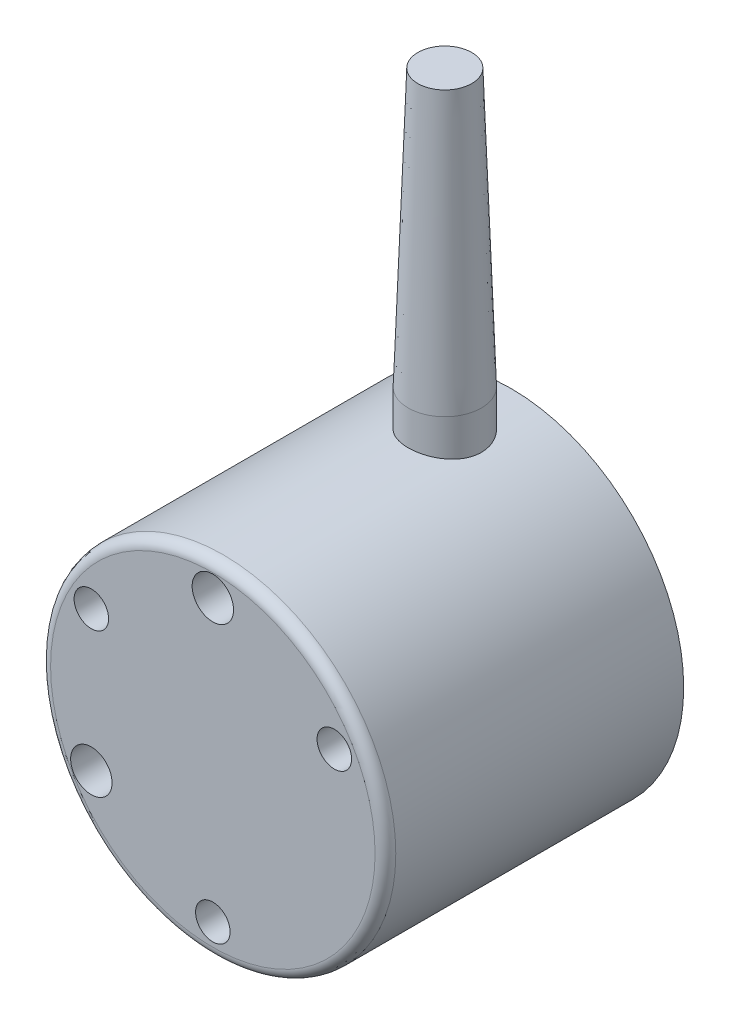
ISO-10303-21;
HEADER;
FILE_DESCRIPTION(('STEP AP214'),'2;1');
FILE_NAME('part.step','',(''),(''),'','','');
FILE_SCHEMA(('AUTOMOTIVE_DESIGN { 1 0 10303 214 1 1 1 1 }'));
ENDSEC;
DATA;
#1=APPLICATION_CONTEXT('core data for automotive mechanical design processes');
#2=APPLICATION_PROTOCOL_DEFINITION('international standard','automotive_design',2000,#1);
#3=PRODUCT_CONTEXT('',#1,'mechanical');
#4=PRODUCT('Part','Part','',(#3));
#5=PRODUCT_RELATED_PRODUCT_CATEGORY('part','',(#4));
#6=PRODUCT_DEFINITION_FORMATION('','',#4);
#7=PRODUCT_DEFINITION_CONTEXT('part definition',#1,'design');
#8=PRODUCT_DEFINITION('design','',#6,#7);
#9=PRODUCT_DEFINITION_SHAPE('','',#8);
#10=(LENGTH_UNIT() NAMED_UNIT(*) SI_UNIT(.MILLI.,.METRE.));
#11=(NAMED_UNIT(*) PLANE_ANGLE_UNIT() SI_UNIT($,.RADIAN.));
#12=(NAMED_UNIT(*) SI_UNIT($,.STERADIAN.) SOLID_ANGLE_UNIT());
#13=UNCERTAINTY_MEASURE_WITH_UNIT(LENGTH_MEASURE(1.E-05),#10,'distance_accuracy_value','');
#14=(GEOMETRIC_REPRESENTATION_CONTEXT(3) GLOBAL_UNCERTAINTY_ASSIGNED_CONTEXT((#13)) GLOBAL_UNIT_ASSIGNED_CONTEXT((#10,
#11,#12)) REPRESENTATION_CONTEXT('',''));
#15=CARTESIAN_POINT('',(0.,0.,0.));
#16=DIRECTION('',(0.,0.,1.));
#17=DIRECTION('',(1.,0.,0.));
#18=AXIS2_PLACEMENT_3D('',#15,#16,#17);
#19=CARTESIAN_POINT('',(0.,0.,-4.8));
#20=DIRECTION('',(0.,0.,1.));
#21=DIRECTION('',(1.,0.,0.));
#22=AXIS2_PLACEMENT_3D('',#19,#20,#21);
#23=CYLINDRICAL_SURFACE('',#22,12.5);
#24=CARTESIAN_POINT('',(0.,0.,-4.8));
#25=DIRECTION('',(0.,0.,1.));
#26=DIRECTION('',(1.,0.,0.));
#27=AXIS2_PLACEMENT_3D('',#24,#25,#26);
#28=CIRCLE('',#27,12.5);
#29=CARTESIAN_POINT('',(12.5,0.,-4.8));
#30=VERTEX_POINT('',#29);
#31=EDGE_CURVE('E143',#30,#30,#28,.T.);
#32=ORIENTED_EDGE('',*,*,#31,.T.);
#33=EDGE_LOOP('',(#32));
#34=FACE_BOUND('',#33,.T.);
#35=CARTESIAN_POINT('',(0.,0.,16.05));
#36=DIRECTION('',(0.,0.,1.));
#37=DIRECTION('',(1.,0.,0.));
#38=AXIS2_PLACEMENT_3D('',#35,#36,#37);
#39=CIRCLE('',#38,12.5);
#40=CARTESIAN_POINT('',(12.5,0.,16.05));
#41=VERTEX_POINT('',#40);
#42=EDGE_CURVE('E11',#41,#41,#39,.F.);
#43=ORIENTED_EDGE('',*,*,#42,.T.);
#44=EDGE_LOOP('',(#43));
#45=FACE_BOUND('',#44,.T.);
#46=CARTESIAN_POINT('',(0.,12.5,-2.65));
#47=CARTESIAN_POINT('',(0.147087655253909,12.4999972775788,-2.64999482647012));
#48=CARTESIAN_POINT('',(0.294238866718605,12.4973773468654,-2.63771254071027));
#49=CARTESIAN_POINT('',(0.584369031257819,12.487178847583,-2.58895448529119));
#50=CARTESIAN_POINT('',(0.727344797311449,12.4795965896498,-2.55246071473185));
#51=CARTESIAN_POINT('',(1.00488847851872,12.460318564185,-2.45646810352624));
#52=CARTESIAN_POINT('',(1.13946474909815,12.4486269637856,-2.396992561795));
#53=CARTESIAN_POINT('',(1.3967220138238,12.4223954659931,-2.25679693743358));
#54=CARTESIAN_POINT('',(1.51940346198492,12.4078556773768,-2.17607766609502));
#55=CARTESIAN_POINT('',(1.75125070479845,12.3772774535956,-1.9943929569075));
#56=CARTESIAN_POINT('',(1.86021075721081,12.3612213760308,-1.89316791742775));
#57=CARTESIAN_POINT('',(2.05973916194239,12.329545980324,-1.67390267785735));
#58=CARTESIAN_POINT('',(2.1503059520169,12.3139266993787,-1.55586105088556));
#59=CARTESIAN_POINT('',(2.31137291559077,12.2847200699253,-1.30480739112259));
#60=CARTESIAN_POINT('',(2.38165626844882,12.2711553638504,-1.17165338542133));
#61=CARTESIAN_POINT('',(2.49877113425445,12.2478460105177,-0.895090035617454));
#62=CARTESIAN_POINT('',(2.54560526970754,12.2381009361078,-0.751681840370374));
#63=CARTESIAN_POINT('',(2.61381671340172,12.2237134836395,-0.460906167001342));
#64=CARTESIAN_POINT('',(2.63555709674783,12.2189984057409,-0.313627533440453));
#65=CARTESIAN_POINT('',(2.65409240881956,12.2149862916238,-0.0174436211816137));
#66=CARTESIAN_POINT('',(2.6508902121243,12.2156886310595,0.131461468095622));
#67=CARTESIAN_POINT('',(2.61992394811367,12.22236609076,0.423988174829154));
#68=CARTESIAN_POINT('',(2.59257958892292,12.2282511065102,0.567656588376124));
#69=CARTESIAN_POINT('',(2.51476924561932,12.2444885832138,0.84831935869211));
#70=CARTESIAN_POINT('',(2.46430203506505,12.2548412811324,0.985313361022342));
#71=CARTESIAN_POINT('',(2.34128754209084,12.2789376517847,1.24992936565752));
#72=CARTESIAN_POINT('',(2.26857704773239,12.292706242802,1.37747313072752));
#73=CARTESIAN_POINT('',(2.10325487515591,12.3220674844341,1.61870537521836));
#74=CARTESIAN_POINT('',(2.0106406403443,12.3376603692583,1.73239207178524));
#75=CARTESIAN_POINT('',(1.8059088459934,12.3693012681458,1.94510145905378));
#76=CARTESIAN_POINT('',(1.6934338976163,12.3853520997575,2.04378006601909));
#77=CARTESIAN_POINT('',(1.45335279013701,12.4158118557269,2.22092784212487));
#78=CARTESIAN_POINT('',(1.32574638822616,12.4302207537298,2.29939668690291));
#79=CARTESIAN_POINT('',(1.05861862661021,12.4558155609354,2.43397457907632));
#80=CARTESIAN_POINT('',(0.919074991433365,12.4669952664195,2.49004066586576));
#81=CARTESIAN_POINT('',(0.632258347980792,12.4848256066245,2.57783510924791));
#82=CARTESIAN_POINT('',(0.484986397107436,12.4914768592056,2.60956678609121));
#83=CARTESIAN_POINT('',(0.189847055468454,12.4994136327095,2.64729612151074));
#84=CARTESIAN_POINT('',(0.042042349849693,12.500797209596,2.65376411461874));
#85=CARTESIAN_POINT('',(-0.252535604458307,12.4983166265008,2.64205429145286));
#86=CARTESIAN_POINT('',(-0.399308918064807,12.4944527998263,2.62387804054463));
#87=CARTESIAN_POINT('',(-0.686114498251495,12.481973242174,2.56378599811046));
#88=CARTESIAN_POINT('',(-0.826200359110639,12.4734065192943,2.52211492313774));
#89=CARTESIAN_POINT('',(-1.09739498231573,12.4524792416744,2.41648619086379));
#90=CARTESIAN_POINT('',(-1.22850301151023,12.4401183775462,2.35252671602871));
#91=CARTESIAN_POINT('',(-1.47997947637284,12.4127310768259,2.2031429932593));
#92=CARTESIAN_POINT('',(-1.60017850955156,12.3976708223251,2.11743990417026));
#93=CARTESIAN_POINT('',(-1.82465772349195,12.3666280126506,1.92737118882823));
#94=CARTESIAN_POINT('',(-1.9289359676956,12.3506453456027,1.82300329559052));
#95=CARTESIAN_POINT('',(-2.12045682357439,12.3192233516319,1.59641541458803));
#96=CARTESIAN_POINT('',(-2.20737474505922,12.3037981423584,1.47391867492246));
#97=CARTESIAN_POINT('',(-2.35940440933264,12.2755535205967,1.21578914476866));
#98=CARTESIAN_POINT('',(-2.42451707375911,12.2627339979837,1.08015690978792));
#99=CARTESIAN_POINT('',(-2.53066240611323,12.2412696787527,0.800320969414382));
#100=CARTESIAN_POINT('',(-2.57182709536076,12.2326020411623,0.656169178763516));
#101=CARTESIAN_POINT('',(-2.62930016982869,12.2203788659203,0.362788707255501));
#102=CARTESIAN_POINT('',(-2.64561225503547,12.2168225673111,0.213560785501153));
#103=CARTESIAN_POINT('',(-2.65276709498461,12.2152705980208,-0.0824674411750886));
#104=CARTESIAN_POINT('',(-2.64412398049741,12.2171626768881,-0.229254967848934));
#105=CARTESIAN_POINT('',(-2.60275773152988,12.2260415393794,-0.519231705391868));
#106=CARTESIAN_POINT('',(-2.57003484601358,12.233028270329,-0.66242095344822));
#107=CARTESIAN_POINT('',(-2.4816794351283,12.2512561373476,-0.940758074452173));
#108=CARTESIAN_POINT('',(-2.42611740138019,12.2624841743207,-1.0759292385752));
#109=CARTESIAN_POINT('',(-2.29372312801172,12.287935483953,-1.33510899798468));
#110=CARTESIAN_POINT('',(-2.21688882896718,12.3021590465851,-1.45911651094745));
#111=CARTESIAN_POINT('',(-2.04240708564062,12.3323370974634,-1.69499286284554));
#112=CARTESIAN_POINT('',(-1.94439140766611,12.3483193732517,-1.80658580934109));
#113=CARTESIAN_POINT('',(-1.73108076536555,12.380022752629,-2.01190922223944));
#114=CARTESIAN_POINT('',(-1.61578182353848,12.3957437951714,-2.1056355655851));
#115=CARTESIAN_POINT('',(-1.36950798597837,12.4253771819497,-2.273639257974));
#116=CARTESIAN_POINT('',(-1.23836124263587,12.4392655005088,-2.34766915211352));
#117=CARTESIAN_POINT('',(-0.965223505324334,12.4634294217265,-2.47251905095068));
#118=CARTESIAN_POINT('',(-0.823241982631671,12.4737081366822,-2.52335906195122));
#119=CARTESIAN_POINT('',(-0.567542457068182,12.4876002244833,-2.59103348585584));
#120=CARTESIAN_POINT('',(-0.455235676696689,12.4922219316734,-2.61310477505356));
#121=CARTESIAN_POINT('',(-0.228632012821106,12.498422817584,-2.64258975405745));
#122=CARTESIAN_POINT('',(-0.114335207926756,12.5000021162116,-2.65000402152453));
#123=CARTESIAN_POINT('',(0.,12.5,-2.65));
#124=B_SPLINE_CURVE_WITH_KNOTS('',3,(#46,#47,#48,#49,#50,#51,#52,#53,#54,#55,#56,#57,#58,#59,
#60,#61,#62,#63,#64,#65,#66,#67,#68,#69,#70,#71,#72,#73,#74,#75,#76,#77,#78,#79,#80,#81,#82,#83,
#84,#85,#86,#87,#88,#89,#90,#91,#92,#93,#94,#95,#96,#97,#98,#99,#100,#101,#102,#103,#104,#105,
#106,#107,#108,#109,#110,#111,#112,#113,#114,#115,#116,#117,#118,#119,#120,#121,#122,#123),
.UNSPECIFIED.,.T.,.F.,(4,2,2,2,2,2,2,2,2,2,2,2,2,2,2,2,2,2,2,2,2,2,2,2,2,2,2,2,2,2,2,2,2,2,2,2,
2,2,4),(0.,0.440844543004694,0.882017215615266,1.32274379597558,1.76345354756235,
2.21013702326534,2.65685842249218,3.1081917700363,3.55947463023544,4.00414274419527,
4.44875961186207,4.88579580980167,5.32285519092693,5.76320174522502,6.20360489495375,
6.65293806825519,7.10227845281038,7.55247642569728,8.00261296146032,8.44432819136316,
8.88601536548747,9.32318483353338,9.76038995942482,10.2035133786431,10.6466906552237,
11.0975083629585,11.5483070136773,11.9965963401219,12.4448189199781,12.88387345563,
13.3229234519009,13.7606284026669,14.1983757436322,14.6444530342902,15.0906331414441,
15.5421791371265,15.9933348362344,16.3360287151845,16.6787090876522),.UNSPECIFIED.);
#125=CARTESIAN_POINT('',(0.,12.5,-2.65));
#126=VERTEX_POINT('',#125);
#127=EDGE_CURVE('E42',#126,#126,#124,.T.);
#128=ORIENTED_EDGE('',*,*,#127,.T.);
#129=EDGE_LOOP('',(#128));
#130=FACE_BOUND('',#129,.T.);
#131=ADVANCED_FACE('F38',(#34,#45,#130),#23,.T.);
#132=CARTESIAN_POINT('',(0.,0.,-4.8));
#133=DIRECTION('',(0.,0.,1.));
#134=DIRECTION('',(1.,0.,0.));
#135=AXIS2_PLACEMENT_3D('',#132,#133,#134);
#136=PLANE('',#135);
#137=CARTESIAN_POINT('',(0.,0.,-4.8));
#138=DIRECTION('',(0.,0.,-1.));
#139=DIRECTION('',(-1.,0.,0.));
#140=AXIS2_PLACEMENT_3D('',#137,#138,#139);
#141=CIRCLE('',#140,3.0175);
#142=CARTESIAN_POINT('',(-3.0175,0.,-4.8));
#143=VERTEX_POINT('',#142);
#144=EDGE_CURVE('E263',#143,#143,#141,.T.);
#145=ORIENTED_EDGE('',*,*,#144,.F.);
#146=EDGE_LOOP('',(#145));
#147=FACE_BOUND('',#146,.T.);
#148=CARTESIAN_POINT('',(9.20800000000001,-4.294,-4.8));
#149=DIRECTION('',(0.,0.,-1.));
#150=DIRECTION('',(-1.,0.,0.));
#151=AXIS2_PLACEMENT_3D('',#148,#149,#150);
#152=CIRCLE('',#151,1.49999999999999);
#153=CARTESIAN_POINT('',(7.70800000000002,-4.294,-4.8));
#154=VERTEX_POINT('',#153);
#155=EDGE_CURVE('E89',#154,#154,#152,.T.);
#156=ORIENTED_EDGE('',*,*,#155,.F.);
#157=EDGE_LOOP('',(#156));
#158=FACE_BOUND('',#157,.T.);
#159=CARTESIAN_POINT('',(5.07999999999992,8.79881810244994,-4.8));
#160=DIRECTION('',(0.,0.,-1.));
#161=DIRECTION('',(-1.,0.,0.));
#162=AXIS2_PLACEMENT_3D('',#159,#160,#161);
#163=CIRCLE('',#162,1.24999999999999);
#164=CARTESIAN_POINT('',(3.82999999999993,8.79881810244994,-4.8));
#165=VERTEX_POINT('',#164);
#166=EDGE_CURVE('E88',#165,#165,#163,.T.);
#167=ORIENTED_EDGE('',*,*,#166,.F.);
#168=EDGE_LOOP('',(#167));
#169=FACE_BOUND('',#168,.T.);
#170=CARTESIAN_POINT('',(5.08000000000004,-8.79881810244988,-4.8));
#171=DIRECTION('',(0.,0.,-1.));
#172=DIRECTION('',(-1.,0.,0.));
#173=AXIS2_PLACEMENT_3D('',#170,#171,#172);
#174=CIRCLE('',#173,1.24999999999999);
#175=CARTESIAN_POINT('',(3.83000000000005,-8.79881810244988,-4.8));
#176=VERTEX_POINT('',#175);
#177=EDGE_CURVE('E101',#176,#176,#174,.T.);
#178=ORIENTED_EDGE('',*,*,#177,.F.);
#179=EDGE_LOOP('',(#178));
#180=FACE_BOUND('',#179,.T.);
#181=CARTESIAN_POINT('',(-10.16,0.,-4.8));
#182=DIRECTION('',(0.,0.,-1.));
#183=DIRECTION('',(-1.,0.,0.));
#184=AXIS2_PLACEMENT_3D('',#181,#182,#183);
#185=CIRCLE('',#184,1.24999999999999);
#186=CARTESIAN_POINT('',(-11.41,0.,-4.8));
#187=VERTEX_POINT('',#186);
#188=EDGE_CURVE('E107',#187,#187,#185,.T.);
#189=ORIENTED_EDGE('',*,*,#188,.F.);
#190=EDGE_LOOP('',(#189));
#191=FACE_BOUND('',#190,.T.);
#192=ORIENTED_EDGE('',*,*,#31,.F.);
#193=EDGE_LOOP('',(#192));
#194=FACE_BOUND('',#193,.T.);
#195=ADVANCED_FACE('F167',(#147,#158,#169,#180,#191,#194),#136,.F.);
#196=CARTESIAN_POINT('',(0.,0.,16.8));
#197=DIRECTION('',(0.,0.,1.));
#198=DIRECTION('',(1.,0.,0.));
#199=AXIS2_PLACEMENT_3D('',#196,#197,#198);
#200=PLANE('',#199);
#201=CARTESIAN_POINT('',(0.,0.,16.8));
#202=DIRECTION('',(0.,0.,1.));
#203=DIRECTION('',(1.,0.,0.));
#204=AXIS2_PLACEMENT_3D('',#201,#202,#203);
#205=CIRCLE('',#204,11.75);
#206=CARTESIAN_POINT('',(11.75,0.,16.8));
#207=VERTEX_POINT('',#206);
#208=EDGE_CURVE('E50',#207,#207,#205,.T.);
#209=ORIENTED_EDGE('',*,*,#208,.T.);
#210=EDGE_LOOP('',(#209));
#211=FACE_BOUND('',#210,.T.);
#212=CARTESIAN_POINT('',(-8.799,-5.08,16.8));
#213=DIRECTION('',(0.,0.,1.));
#214=DIRECTION('',(1.,0.,0.));
#215=AXIS2_PLACEMENT_3D('',#212,#213,#214);
#216=CIRCLE('',#215,1.5);
#217=CARTESIAN_POINT('',(-7.299,-5.08,16.8));
#218=VERTEX_POINT('',#217);
#219=EDGE_CURVE('E113',#218,#218,#216,.T.);
#220=ORIENTED_EDGE('',*,*,#219,.F.);
#221=EDGE_LOOP('',(#220));
#222=FACE_BOUND('',#221,.T.);
#223=CARTESIAN_POINT('',(0.,10.16,16.8));
#224=DIRECTION('',(0.,0.,1.));
#225=DIRECTION('',(1.,0.,0.));
#226=AXIS2_PLACEMENT_3D('',#223,#224,#225);
#227=CIRCLE('',#226,1.5);
#228=CARTESIAN_POINT('',(1.5,10.16,16.8));
#229=VERTEX_POINT('',#228);
#230=EDGE_CURVE('E119',#229,#229,#227,.T.);
#231=ORIENTED_EDGE('',*,*,#230,.F.);
#232=EDGE_LOOP('',(#231));
#233=FACE_BOUND('',#232,.T.);
#234=CARTESIAN_POINT('',(-8.79881810244994,5.07999999999992,16.8));
#235=DIRECTION('',(0.,0.,1.));
#236=DIRECTION('',(1.,0.,0.));
#237=AXIS2_PLACEMENT_3D('',#234,#235,#236);
#238=CIRCLE('',#237,1.24999999999999);
#239=CARTESIAN_POINT('',(-7.54881810244995,5.07999999999992,16.8));
#240=VERTEX_POINT('',#239);
#241=EDGE_CURVE('E125',#240,#240,#238,.T.);
#242=ORIENTED_EDGE('',*,*,#241,.F.);
#243=EDGE_LOOP('',(#242));
#244=FACE_BOUND('',#243,.T.);
#245=CARTESIAN_POINT('',(8.79881810244988,5.08000000000004,16.8));
#246=DIRECTION('',(0.,0.,1.));
#247=DIRECTION('',(1.,0.,0.));
#248=AXIS2_PLACEMENT_3D('',#245,#246,#247);
#249=CIRCLE('',#248,1.24999999999999);
#250=CARTESIAN_POINT('',(10.0488181024499,5.08000000000004,16.8));
#251=VERTEX_POINT('',#250);
#252=EDGE_CURVE('E131',#251,#251,#249,.T.);
#253=ORIENTED_EDGE('',*,*,#252,.F.);
#254=EDGE_LOOP('',(#253));
#255=FACE_BOUND('',#254,.T.);
#256=CARTESIAN_POINT('',(0.,-10.16,16.8));
#257=DIRECTION('',(0.,0.,1.));
#258=DIRECTION('',(1.,0.,0.));
#259=AXIS2_PLACEMENT_3D('',#256,#257,#258);
#260=CIRCLE('',#259,1.24999999999999);
#261=CARTESIAN_POINT('',(1.24999999999999,-10.16,16.8));
#262=VERTEX_POINT('',#261);
#263=EDGE_CURVE('E137',#262,#262,#260,.T.);
#264=ORIENTED_EDGE('',*,*,#263,.F.);
#265=EDGE_LOOP('',(#264));
#266=FACE_BOUND('',#265,.T.);
#267=ADVANCED_FACE('F149',(#211,#222,#233,#244,#255,#266),#200,.T.);
#268=CARTESIAN_POINT('',(0.,-10.16,9.3));
#269=DIRECTION('',(0.,0.,1.));
#270=DIRECTION('',(1.,0.,0.));
#271=AXIS2_PLACEMENT_3D('',#268,#269,#270);
#272=CONICAL_SURFACE('',#271,1.24999999999999,1.02974425867665);
#273=CARTESIAN_POINT('',(0.,-10.16,8.54892422621555));
#274=VERTEX_POINT('',#273);
#275=VERTEX_LOOP('',#274);
#276=FACE_BOUND('',#275,.T.);
#277=CARTESIAN_POINT('',(0.,-10.16,9.3));
#278=DIRECTION('',(0.,0.,1.));
#279=DIRECTION('',(1.,0.,0.));
#280=AXIS2_PLACEMENT_3D('',#277,#278,#279);
#281=CIRCLE('',#280,1.24999999999999);
#282=CARTESIAN_POINT('',(1.24999999999999,-10.16,9.3));
#283=VERTEX_POINT('',#282);
#284=EDGE_CURVE('E140',#283,#283,#281,.T.);
#285=ORIENTED_EDGE('',*,*,#284,.T.);
#286=EDGE_LOOP('',(#285));
#287=FACE_BOUND('',#286,.T.);
#288=ADVANCED_FACE('F179',(#276,#287),#272,.F.);
#289=CARTESIAN_POINT('',(0.,-10.16,16.8));
#290=DIRECTION('',(0.,0.,1.));
#291=DIRECTION('',(1.,0.,0.));
#292=AXIS2_PLACEMENT_3D('',#289,#290,#291);
#293=CYLINDRICAL_SURFACE('',#292,1.24999999999999);
#294=ORIENTED_EDGE('',*,*,#284,.F.);
#295=EDGE_LOOP('',(#294));
#296=FACE_BOUND('',#295,.T.);
#297=ORIENTED_EDGE('',*,*,#263,.T.);
#298=EDGE_LOOP('',(#297));
#299=FACE_BOUND('',#298,.T.);
#300=ADVANCED_FACE('F182',(#296,#299),#293,.F.);
#301=CARTESIAN_POINT('',(8.79881810244988,5.08000000000004,9.3));
#302=DIRECTION('',(0.,0.,1.));
#303=DIRECTION('',(1.,0.,0.));
#304=AXIS2_PLACEMENT_3D('',#301,#302,#303);
#305=CONICAL_SURFACE('',#304,1.24999999999999,1.02974425867665);
#306=CARTESIAN_POINT('',(8.79881810244987,5.08000000000004,8.54892422621555));
#307=VERTEX_POINT('',#306);
#308=VERTEX_LOOP('',#307);
#309=FACE_BOUND('',#308,.T.);
#310=CARTESIAN_POINT('',(8.79881810244988,5.08000000000004,9.3));
#311=DIRECTION('',(0.,0.,1.));
#312=DIRECTION('',(1.,0.,0.));
#313=AXIS2_PLACEMENT_3D('',#310,#311,#312);
#314=CIRCLE('',#313,1.24999999999999);
#315=CARTESIAN_POINT('',(10.0488181024499,5.08000000000004,9.3));
#316=VERTEX_POINT('',#315);
#317=EDGE_CURVE('E134',#316,#316,#314,.T.);
#318=ORIENTED_EDGE('',*,*,#317,.T.);
#319=EDGE_LOOP('',(#318));
#320=FACE_BOUND('',#319,.T.);
#321=ADVANCED_FACE('F185',(#309,#320),#305,.F.);
#322=CARTESIAN_POINT('',(8.79881810244988,5.08000000000004,16.8));
#323=DIRECTION('',(0.,0.,1.));
#324=DIRECTION('',(1.,0.,0.));
#325=AXIS2_PLACEMENT_3D('',#322,#323,#324);
#326=CYLINDRICAL_SURFACE('',#325,1.24999999999999);
#327=ORIENTED_EDGE('',*,*,#317,.F.);
#328=EDGE_LOOP('',(#327));
#329=FACE_BOUND('',#328,.T.);
#330=ORIENTED_EDGE('',*,*,#252,.T.);
#331=EDGE_LOOP('',(#330));
#332=FACE_BOUND('',#331,.T.);
#333=ADVANCED_FACE('F189',(#329,#332),#326,.F.);
#334=CARTESIAN_POINT('',(-8.79881810244994,5.07999999999992,9.3));
#335=DIRECTION('',(0.,0.,1.));
#336=DIRECTION('',(1.,0.,0.));
#337=AXIS2_PLACEMENT_3D('',#334,#335,#336);
#338=CONICAL_SURFACE('',#337,1.24999999999999,1.02974425867665);
#339=CARTESIAN_POINT('',(-8.79881810244995,5.07999999999992,8.54892422621555));
#340=VERTEX_POINT('',#339);
#341=VERTEX_LOOP('',#340);
#342=FACE_BOUND('',#341,.T.);
#343=CARTESIAN_POINT('',(-8.79881810244994,5.07999999999992,9.3));
#344=DIRECTION('',(0.,0.,1.));
#345=DIRECTION('',(1.,0.,0.));
#346=AXIS2_PLACEMENT_3D('',#343,#344,#345);
#347=CIRCLE('',#346,1.24999999999999);
#348=CARTESIAN_POINT('',(-7.54881810244996,5.07999999999992,9.3));
#349=VERTEX_POINT('',#348);
#350=EDGE_CURVE('E128',#349,#349,#347,.T.);
#351=ORIENTED_EDGE('',*,*,#350,.T.);
#352=EDGE_LOOP('',(#351));
#353=FACE_BOUND('',#352,.T.);
#354=ADVANCED_FACE('F192',(#342,#353),#338,.F.);
#355=CARTESIAN_POINT('',(-8.79881810244994,5.07999999999992,16.8));
#356=DIRECTION('',(0.,0.,1.));
#357=DIRECTION('',(1.,0.,0.));
#358=AXIS2_PLACEMENT_3D('',#355,#356,#357);
#359=CYLINDRICAL_SURFACE('',#358,1.24999999999999);
#360=ORIENTED_EDGE('',*,*,#350,.F.);
#361=EDGE_LOOP('',(#360));
#362=FACE_BOUND('',#361,.T.);
#363=ORIENTED_EDGE('',*,*,#241,.T.);
#364=EDGE_LOOP('',(#363));
#365=FACE_BOUND('',#364,.T.);
#366=ADVANCED_FACE('F196',(#362,#365),#359,.F.);
#367=CARTESIAN_POINT('',(0.,10.16,13.5));
#368=DIRECTION('',(0.,0.,1.));
#369=DIRECTION('',(1.,0.,0.));
#370=AXIS2_PLACEMENT_3D('',#367,#368,#369);
#371=CONICAL_SURFACE('',#370,1.5,1.02974425867665);
#372=CARTESIAN_POINT('',(0.,10.16,12.5987090714587));
#373=VERTEX_POINT('',#372);
#374=VERTEX_LOOP('',#373);
#375=FACE_BOUND('',#374,.T.);
#376=CARTESIAN_POINT('',(0.,10.16,13.5));
#377=DIRECTION('',(0.,0.,1.));
#378=DIRECTION('',(1.,0.,0.));
#379=AXIS2_PLACEMENT_3D('',#376,#377,#378);
#380=CIRCLE('',#379,1.5);
#381=CARTESIAN_POINT('',(1.5,10.16,13.5));
#382=VERTEX_POINT('',#381);
#383=EDGE_CURVE('E122',#382,#382,#380,.T.);
#384=ORIENTED_EDGE('',*,*,#383,.T.);
#385=EDGE_LOOP('',(#384));
#386=FACE_BOUND('',#385,.T.);
#387=ADVANCED_FACE('F200',(#375,#386),#371,.F.);
#388=CARTESIAN_POINT('',(0.,10.16,16.8));
#389=DIRECTION('',(0.,0.,1.));
#390=DIRECTION('',(1.,0.,0.));
#391=AXIS2_PLACEMENT_3D('',#388,#389,#390);
#392=CYLINDRICAL_SURFACE('',#391,1.5);
#393=ORIENTED_EDGE('',*,*,#383,.F.);
#394=EDGE_LOOP('',(#393));
#395=FACE_BOUND('',#394,.T.);
#396=ORIENTED_EDGE('',*,*,#230,.T.);
#397=EDGE_LOOP('',(#396));
#398=FACE_BOUND('',#397,.T.);
#399=ADVANCED_FACE('F204',(#395,#398),#392,.F.);
#400=CARTESIAN_POINT('',(-8.799,-5.08,13.5));
#401=DIRECTION('',(0.,0.,1.));
#402=DIRECTION('',(1.,0.,0.));
#403=AXIS2_PLACEMENT_3D('',#400,#401,#402);
#404=CONICAL_SURFACE('',#403,1.5,1.02974425867665);
#405=CARTESIAN_POINT('',(-8.799,-5.08,12.5987090714587));
#406=VERTEX_POINT('',#405);
#407=VERTEX_LOOP('',#406);
#408=FACE_BOUND('',#407,.T.);
#409=CARTESIAN_POINT('',(-8.799,-5.08,13.5));
#410=DIRECTION('',(0.,0.,1.));
#411=DIRECTION('',(1.,0.,0.));
#412=AXIS2_PLACEMENT_3D('',#409,#410,#411);
#413=CIRCLE('',#412,1.5);
#414=CARTESIAN_POINT('',(-7.299,-5.08,13.5));
#415=VERTEX_POINT('',#414);
#416=EDGE_CURVE('E116',#415,#415,#413,.T.);
#417=ORIENTED_EDGE('',*,*,#416,.T.);
#418=EDGE_LOOP('',(#417));
#419=FACE_BOUND('',#418,.T.);
#420=ADVANCED_FACE('F208',(#408,#419),#404,.F.);
#421=CARTESIAN_POINT('',(-8.799,-5.08,16.8));
#422=DIRECTION('',(0.,0.,1.));
#423=DIRECTION('',(1.,0.,0.));
#424=AXIS2_PLACEMENT_3D('',#421,#422,#423);
#425=CYLINDRICAL_SURFACE('',#424,1.5);
#426=ORIENTED_EDGE('',*,*,#416,.F.);
#427=EDGE_LOOP('',(#426));
#428=FACE_BOUND('',#427,.T.);
#429=ORIENTED_EDGE('',*,*,#219,.T.);
#430=EDGE_LOOP('',(#429));
#431=FACE_BOUND('',#430,.T.);
#432=ADVANCED_FACE('F212',(#428,#431),#425,.F.);
#433=CARTESIAN_POINT('',(-10.16,0.,2.69999999999999));
#434=DIRECTION('',(0.,0.,-1.));
#435=DIRECTION('',(-1.,0.,0.));
#436=AXIS2_PLACEMENT_3D('',#433,#434,#435);
#437=CONICAL_SURFACE('',#436,1.24999999999999,1.02974425867664);
#438=CARTESIAN_POINT('',(-10.16,0.,3.45107577378445));
#439=VERTEX_POINT('',#438);
#440=VERTEX_LOOP('',#439);
#441=FACE_BOUND('',#440,.T.);
#442=CARTESIAN_POINT('',(-10.16,0.,2.69999999999999));
#443=DIRECTION('',(0.,0.,-1.));
#444=DIRECTION('',(-1.,0.,0.));
#445=AXIS2_PLACEMENT_3D('',#442,#443,#444);
#446=CIRCLE('',#445,1.24999999999999);
#447=CARTESIAN_POINT('',(-11.41,0.,2.69999999999999));
#448=VERTEX_POINT('',#447);
#449=EDGE_CURVE('E110',#448,#448,#446,.T.);
#450=ORIENTED_EDGE('',*,*,#449,.T.);
#451=EDGE_LOOP('',(#450));
#452=FACE_BOUND('',#451,.T.);
#453=ADVANCED_FACE('F216',(#441,#452),#437,.F.);
#454=CARTESIAN_POINT('',(-10.16,0.,-4.8));
#455=DIRECTION('',(0.,0.,-1.));
#456=DIRECTION('',(-1.,0.,0.));
#457=AXIS2_PLACEMENT_3D('',#454,#455,#456);
#458=CYLINDRICAL_SURFACE('',#457,1.24999999999999);
#459=ORIENTED_EDGE('',*,*,#449,.F.);
#460=EDGE_LOOP('',(#459));
#461=FACE_BOUND('',#460,.T.);
#462=ORIENTED_EDGE('',*,*,#188,.T.);
#463=EDGE_LOOP('',(#462));
#464=FACE_BOUND('',#463,.T.);
#465=ADVANCED_FACE('F220',(#461,#464),#458,.F.);
#466=CARTESIAN_POINT('',(5.08000000000004,-8.79881810244988,2.69999999999999));
#467=DIRECTION('',(0.,0.,-1.));
#468=DIRECTION('',(-1.,0.,0.));
#469=AXIS2_PLACEMENT_3D('',#466,#467,#468);
#470=CONICAL_SURFACE('',#469,1.24999999999999,1.02974425867664);
#471=CARTESIAN_POINT('',(5.08000000000004,-8.79881810244988,3.45107577378445));
#472=VERTEX_POINT('',#471);
#473=VERTEX_LOOP('',#472);
#474=FACE_BOUND('',#473,.T.);
#475=CARTESIAN_POINT('',(5.08000000000004,-8.79881810244988,2.69999999999999));
#476=DIRECTION('',(0.,0.,-1.));
#477=DIRECTION('',(-1.,0.,0.));
#478=AXIS2_PLACEMENT_3D('',#475,#476,#477);
#479=CIRCLE('',#478,1.24999999999999);
#480=CARTESIAN_POINT('',(3.83000000000005,-8.79881810244988,2.69999999999999));
#481=VERTEX_POINT('',#480);
#482=EDGE_CURVE('E104',#481,#481,#479,.T.);
#483=ORIENTED_EDGE('',*,*,#482,.T.);
#484=EDGE_LOOP('',(#483));
#485=FACE_BOUND('',#484,.T.);
#486=ADVANCED_FACE('F224',(#474,#485),#470,.F.);
#487=CARTESIAN_POINT('',(5.08000000000004,-8.79881810244988,-4.8));
#488=DIRECTION('',(0.,0.,-1.));
#489=DIRECTION('',(-1.,0.,0.));
#490=AXIS2_PLACEMENT_3D('',#487,#488,#489);
#491=CYLINDRICAL_SURFACE('',#490,1.24999999999999);
#492=ORIENTED_EDGE('',*,*,#482,.F.);
#493=EDGE_LOOP('',(#492));
#494=FACE_BOUND('',#493,.T.);
#495=ORIENTED_EDGE('',*,*,#177,.T.);
#496=EDGE_LOOP('',(#495));
#497=FACE_BOUND('',#496,.T.);
#498=ADVANCED_FACE('F228',(#494,#497),#491,.F.);
#499=CARTESIAN_POINT('',(5.07999999999992,8.79881810244994,2.69999999999999));
#500=DIRECTION('',(0.,0.,-1.));
#501=DIRECTION('',(-1.,0.,0.));
#502=AXIS2_PLACEMENT_3D('',#499,#500,#501);
#503=CONICAL_SURFACE('',#502,1.24999999999999,1.02974425867664);
#504=CARTESIAN_POINT('',(5.07999999999992,8.79881810244994,3.45107577378445));
#505=VERTEX_POINT('',#504);
#506=VERTEX_LOOP('',#505);
#507=FACE_BOUND('',#506,.T.);
#508=CARTESIAN_POINT('',(5.07999999999992,8.79881810244994,2.69999999999999));
#509=DIRECTION('',(0.,0.,-1.));
#510=DIRECTION('',(-1.,0.,0.));
#511=AXIS2_PLACEMENT_3D('',#508,#509,#510);
#512=CIRCLE('',#511,1.24999999999999);
#513=CARTESIAN_POINT('',(3.82999999999993,8.79881810244994,2.69999999999999));
#514=VERTEX_POINT('',#513);
#515=EDGE_CURVE('E92',#514,#514,#512,.T.);
#516=ORIENTED_EDGE('',*,*,#515,.T.);
#517=EDGE_LOOP('',(#516));
#518=FACE_BOUND('',#517,.T.);
#519=ADVANCED_FACE('F232',(#507,#518),#503,.F.);
#520=CARTESIAN_POINT('',(5.07999999999992,8.79881810244994,-4.8));
#521=DIRECTION('',(0.,0.,-1.));
#522=DIRECTION('',(-1.,0.,0.));
#523=AXIS2_PLACEMENT_3D('',#520,#521,#522);
#524=CYLINDRICAL_SURFACE('',#523,1.24999999999999);
#525=ORIENTED_EDGE('',*,*,#515,.F.);
#526=EDGE_LOOP('',(#525));
#527=FACE_BOUND('',#526,.T.);
#528=ORIENTED_EDGE('',*,*,#166,.T.);
#529=EDGE_LOOP('',(#528));
#530=FACE_BOUND('',#529,.T.);
#531=ADVANCED_FACE('F82',(#527,#530),#524,.F.);
#532=CARTESIAN_POINT('',(9.20800000000001,-4.294,-1.5));
#533=DIRECTION('',(0.,0.,-1.));
#534=DIRECTION('',(-1.,0.,0.));
#535=AXIS2_PLACEMENT_3D('',#532,#533,#534);
#536=CONICAL_SURFACE('',#535,1.49999999999999,1.02974425867665);
#537=CARTESIAN_POINT('',(9.20800000000001,-4.294,-0.598709071458659));
#538=VERTEX_POINT('',#537);
#539=VERTEX_LOOP('',#538);
#540=FACE_BOUND('',#539,.T.);
#541=CARTESIAN_POINT('',(9.20800000000001,-4.294,-1.5));
#542=DIRECTION('',(0.,0.,-1.));
#543=DIRECTION('',(-1.,0.,0.));
#544=AXIS2_PLACEMENT_3D('',#541,#542,#543);
#545=CIRCLE('',#544,1.49999999999999);
#546=CARTESIAN_POINT('',(7.70800000000002,-4.294,-1.5));
#547=VERTEX_POINT('',#546);
#548=EDGE_CURVE('E86',#547,#547,#545,.T.);
#549=ORIENTED_EDGE('',*,*,#548,.T.);
#550=EDGE_LOOP('',(#549));
#551=FACE_BOUND('',#550,.T.);
#552=ADVANCED_FACE('F78',(#540,#551),#536,.F.);
#553=CARTESIAN_POINT('',(9.20800000000001,-4.294,-4.8));
#554=DIRECTION('',(0.,0.,-1.));
#555=DIRECTION('',(-1.,0.,0.));
#556=AXIS2_PLACEMENT_3D('',#553,#554,#555);
#557=CYLINDRICAL_SURFACE('',#556,1.49999999999999);
#558=ORIENTED_EDGE('',*,*,#548,.F.);
#559=EDGE_LOOP('',(#558));
#560=FACE_BOUND('',#559,.T.);
#561=ORIENTED_EDGE('',*,*,#155,.T.);
#562=EDGE_LOOP('',(#561));
#563=FACE_BOUND('',#562,.T.);
#564=ADVANCED_FACE('F81',(#560,#563),#557,.F.);
#565=CARTESIAN_POINT('',(0.,0.,-2.7));
#566=DIRECTION('',(0.,0.,-1.));
#567=DIRECTION('',(-1.,0.,0.));
#568=AXIS2_PLACEMENT_3D('',#565,#566,#567);
#569=CYLINDRICAL_SURFACE('',#568,3.0175);
#570=CARTESIAN_POINT('',(0.,0.,-2.7));
#571=DIRECTION('',(0.,0.,-1.));
#572=DIRECTION('',(-1.,0.,0.));
#573=AXIS2_PLACEMENT_3D('',#570,#571,#572);
#574=CIRCLE('',#573,3.0175);
#575=CARTESIAN_POINT('',(-3.0175,0.,-2.7));
#576=VERTEX_POINT('',#575);
#577=EDGE_CURVE('E95',#576,#576,#574,.T.);
#578=ORIENTED_EDGE('',*,*,#577,.F.);
#579=EDGE_LOOP('',(#578));
#580=FACE_BOUND('',#579,.T.);
#581=ORIENTED_EDGE('',*,*,#144,.T.);
#582=EDGE_LOOP('',(#581));
#583=FACE_BOUND('',#582,.T.);
#584=ADVANCED_FACE('F162',(#580,#583),#569,.F.);
#585=CARTESIAN_POINT('',(0.,0.,-2.7));
#586=DIRECTION('',(0.,0.,-1.));
#587=DIRECTION('',(-1.,0.,0.));
#588=AXIS2_PLACEMENT_3D('',#585,#586,#587);
#589=PLANE('',#588);
#590=ORIENTED_EDGE('',*,*,#577,.T.);
#591=EDGE_LOOP('',(#590));
#592=FACE_BOUND('',#591,.T.);
#593=ADVANCED_FACE('F154',(#592),#589,.T.);
#594=CARTESIAN_POINT('',(0.,0.,16.05));
#595=DIRECTION('',(0.,0.,1.));
#596=DIRECTION('',(1.,0.,0.));
#597=AXIS2_PLACEMENT_3D('',#594,#595,#596);
#598=TOROIDAL_SURFACE('',#597,11.75,0.75);
#599=ORIENTED_EDGE('',*,*,#42,.F.);
#600=EDGE_LOOP('',(#599));
#601=FACE_BOUND('',#600,.T.);
#602=ORIENTED_EDGE('',*,*,#208,.F.);
#603=EDGE_LOOP('',(#602));
#604=FACE_BOUND('',#603,.T.);
#605=ADVANCED_FACE('F40',(#601,#604),#598,.T.);
#606=CARTESIAN_POINT('',(0.,15.,0.));
#607=DIRECTION('',(0.,-1.,0.));
#608=DIRECTION('',(0.,0.,-1.));
#609=AXIS2_PLACEMENT_3D('',#606,#607,#608);
#610=CYLINDRICAL_SURFACE('',#609,2.65);
#611=ORIENTED_EDGE('',*,*,#127,.F.);
#612=EDGE_LOOP('',(#611));
#613=FACE_BOUND('',#612,.T.);
#614=CARTESIAN_POINT('',(0.,15.,0.));
#615=DIRECTION('',(0.,1.,0.));
#616=DIRECTION('',(0.,0.,1.));
#617=AXIS2_PLACEMENT_3D('',#614,#615,#616);
#618=CIRCLE('',#617,2.65);
#619=CARTESIAN_POINT('',(0.,15.,2.65));
#620=VERTEX_POINT('',#619);
#621=EDGE_CURVE('E257',#620,#620,#618,.T.);
#622=ORIENTED_EDGE('',*,*,#621,.F.);
#623=EDGE_LOOP('',(#622));
#624=FACE_BOUND('',#623,.T.);
#625=ADVANCED_FACE('F153',(#613,#624),#610,.T.);
#626=CARTESIAN_POINT('',(0.,15.,0.));
#627=DIRECTION('',(0.,-1.,0.));
#628=DIRECTION('',(0.,0.,1.));
#629=AXIS2_PLACEMENT_3D('',#626,#627,#628);
#630=CONICAL_SURFACE('',#629,2.65,0.0349065850398867);
#631=CARTESIAN_POINT('',(0.,35.,0.));
#632=DIRECTION('',(0.,1.,0.));
#633=DIRECTION('',(0.,0.,1.));
#634=AXIS2_PLACEMENT_3D('',#631,#632,#633);
#635=CIRCLE('',#634,1.95158461016504);
#636=CARTESIAN_POINT('',(0.,35.,1.95158461016504));
#637=VERTEX_POINT('',#636);
#638=EDGE_CURVE('E256',#637,#637,#635,.T.);
#639=ORIENTED_EDGE('',*,*,#638,.F.);
#640=EDGE_LOOP('',(#639));
#641=FACE_BOUND('',#640,.T.);
#642=ORIENTED_EDGE('',*,*,#621,.T.);
#643=EDGE_LOOP('',(#642));
#644=FACE_BOUND('',#643,.T.);
#645=ADVANCED_FACE('F160',(#641,#644),#630,.T.);
#646=CARTESIAN_POINT('',(0.,35.,0.));
#647=DIRECTION('',(0.,1.,0.));
#648=DIRECTION('',(0.,0.,1.));
#649=AXIS2_PLACEMENT_3D('',#646,#647,#648);
#650=PLANE('',#649);
#651=ORIENTED_EDGE('',*,*,#638,.T.);
#652=EDGE_LOOP('',(#651));
#653=FACE_BOUND('',#652,.T.);
#654=ADVANCED_FACE('F248',(#653),#650,.T.);
#655=CLOSED_SHELL('',(#131,#195,#267,#288,#300,#321,#333,#354,#366,#387,#399,#420,#432,#453,
#465,#486,#498,#519,#531,#552,#564,#584,#593,#605,#625,#645,#654));
#656=MANIFOLD_SOLID_BREP('B2',#655);
#657=ADVANCED_BREP_SHAPE_REPRESENTATION('',(#18,#656),#14);
#658=SHAPE_DEFINITION_REPRESENTATION(#9,#657);
ENDSEC;
END-ISO-10303-21;
